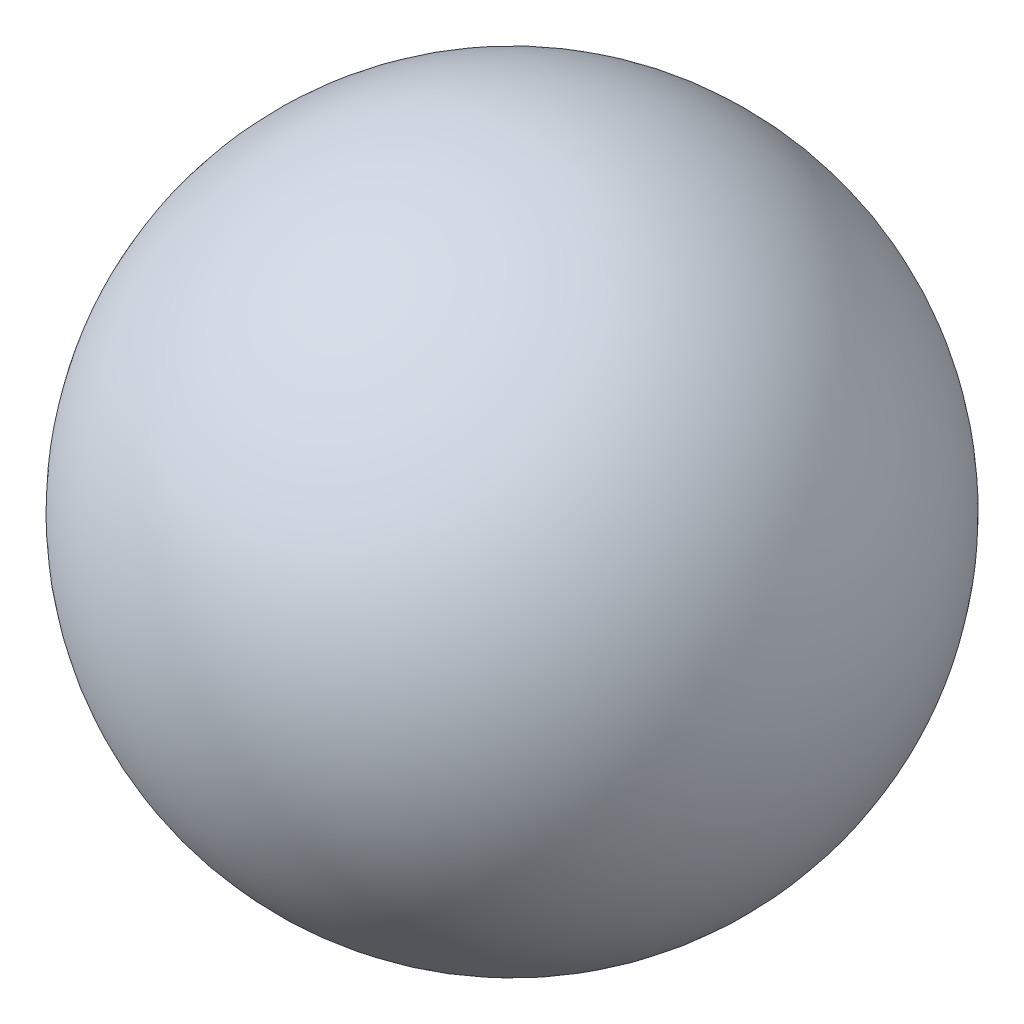
ISO-10303-21;
HEADER;
FILE_DESCRIPTION(('STEP AP214'),'2;1');
FILE_NAME('part.step','',(''),(''),'','','');
FILE_SCHEMA(('AUTOMOTIVE_DESIGN { 1 0 10303 214 1 1 1 1 }'));
ENDSEC;
DATA;
#1=APPLICATION_CONTEXT('core data for automotive mechanical design processes');
#2=APPLICATION_PROTOCOL_DEFINITION('international standard','automotive_design',2000,#1);
#3=PRODUCT_CONTEXT('',#1,'mechanical');
#4=PRODUCT('Part','Part','',(#3));
#5=PRODUCT_RELATED_PRODUCT_CATEGORY('part','',(#4));
#6=PRODUCT_DEFINITION_FORMATION('','',#4);
#7=PRODUCT_DEFINITION_CONTEXT('part definition',#1,'design');
#8=PRODUCT_DEFINITION('design','',#6,#7);
#9=PRODUCT_DEFINITION_SHAPE('','',#8);
#10=(LENGTH_UNIT() NAMED_UNIT(*) SI_UNIT(.MILLI.,.METRE.));
#11=(NAMED_UNIT(*) PLANE_ANGLE_UNIT() SI_UNIT($,.RADIAN.));
#12=(NAMED_UNIT(*) SI_UNIT($,.STERADIAN.) SOLID_ANGLE_UNIT());
#13=UNCERTAINTY_MEASURE_WITH_UNIT(LENGTH_MEASURE(1.E-05),#10,'distance_accuracy_value','');
#14=(GEOMETRIC_REPRESENTATION_CONTEXT(3) GLOBAL_UNCERTAINTY_ASSIGNED_CONTEXT((#13)) GLOBAL_UNIT_ASSIGNED_CONTEXT((#10,
#11,#12)) REPRESENTATION_CONTEXT('',''));
#15=CARTESIAN_POINT('',(0.,0.,0.));
#16=DIRECTION('',(0.,0.,1.));
#17=DIRECTION('',(1.,0.,0.));
#18=AXIS2_PLACEMENT_3D('',#15,#16,#17);
#19=CARTESIAN_POINT('',(0.,0.,0.));
#20=DIRECTION('',(0.,1.,0.));
#21=DIRECTION('',(1.,0.,0.));
#22=AXIS2_PLACEMENT_3D('',#19,#20,#21);
#23=SPHERICAL_SURFACE('',#22,15.);
#24=CARTESIAN_POINT('',(0.,0.,0.));
#25=DIRECTION('',(0.997302556623209,0.073400326559388,-5.11251999377807E-05));
#26=DIRECTION('',(-0.0734003266553143,0.997302557926577,0.));
#27=AXIS2_PLACEMENT_3D('',#24,#25,#26);
#28=SPHERICAL_SURFACE('',#27,15.);
#29=CARTESIAN_POINT('',(-14.3465187882367,-1.05588736041395,0.000735452482889611));
#30=DIRECTION('',(0.997302556623209,0.073400326559388,-5.11251999377807E-05));
#31=DIRECTION('',(-0.0734003266553143,0.997302557926577,0.));
#32=AXIS2_PLACEMENT_3D('',#29,#30,#31);
#33=CIRCLE('',#32,4.25);
#34=CARTESIAN_POINT('',(-14.6584701765218,3.182648510774,0.000735452482889611));
#35=VERTEX_POINT('',#34);
#36=EDGE_CURVE('E11',#35,#35,#33,.T.);
#37=ORIENTED_EDGE('',*,*,#36,.T.);
#38=EDGE_LOOP('',(#37));
#39=FACE_BOUND('',#38,.T.);
#40=ADVANCED_FACE('F47',(#39),#28,.T.);
#41=CARTESIAN_POINT('',(-14.9595383493481,-1.10100489839082,0.000766877999067682));
#42=DIRECTION('',(-0.997302556623209,-0.073400326559388,5.11251999377807E-05));
#43=DIRECTION('',(0.0734003266553143,-0.997302557926577,0.));
#44=AXIS2_PLACEMENT_3D('',#41,#42,#43);
#45=CYLINDRICAL_SURFACE('',#44,4.25);
#46=CARTESIAN_POINT('',(-1.49595383493481,-0.110100489839081,7.66877999076422E-05));
#47=DIRECTION('',(-0.997302556623209,-0.073400326559388,5.11251999377807E-05));
#48=DIRECTION('',(0.0734003266553143,-0.997302557926577,0.));
#49=AXIS2_PLACEMENT_3D('',#46,#47,#48);
#50=CIRCLE('',#49,4.25);
#51=CARTESIAN_POINT('',(-1.18400244664972,-4.34863636102703,7.66877999076422E-05));
#52=VERTEX_POINT('',#51);
#53=EDGE_CURVE('E54',#52,#52,#50,.T.);
#54=ORIENTED_EDGE('',*,*,#53,.F.);
#55=EDGE_LOOP('',(#54));
#56=FACE_BOUND('',#55,.T.);
#57=ORIENTED_EDGE('',*,*,#36,.F.);
#58=EDGE_LOOP('',(#57));
#59=FACE_BOUND('',#58,.T.);
#60=ADVANCED_FACE('F60',(#56,#59),#45,.F.);
#61=CARTESIAN_POINT('',(-1.49595383493481,-0.110100489839081,7.66877999076422E-05));
#62=DIRECTION('',(-0.997302556623209,-0.073400326559388,5.11251999377807E-05));
#63=DIRECTION('',(0.0734003266553143,-0.997302557926577,0.));
#64=AXIS2_PLACEMENT_3D('',#61,#62,#63);
#65=CONICAL_SURFACE('',#64,4.25,0.785398163397447);
#66=CARTESIAN_POINT('',(2.74258203071383,0.201850898038314,-0.000140594299830995));
#67=VERTEX_POINT('',#66);
#68=VERTEX_LOOP('',#67);
#69=FACE_BOUND('',#68,.T.);
#70=ORIENTED_EDGE('',*,*,#53,.T.);
#71=EDGE_LOOP('',(#70));
#72=FACE_BOUND('',#71,.T.);
#73=ADVANCED_FACE('F57',(#69,#72),#65,.F.);
#74=CLOSED_SHELL('',(#40,#60,#73));
#75=MANIFOLD_SOLID_BREP('B2',#74);
#76=ADVANCED_BREP_SHAPE_REPRESENTATION('',(#18,#75),#14);
#77=SHAPE_DEFINITION_REPRESENTATION(#9,#76);
ENDSEC;
END-ISO-10303-21;
